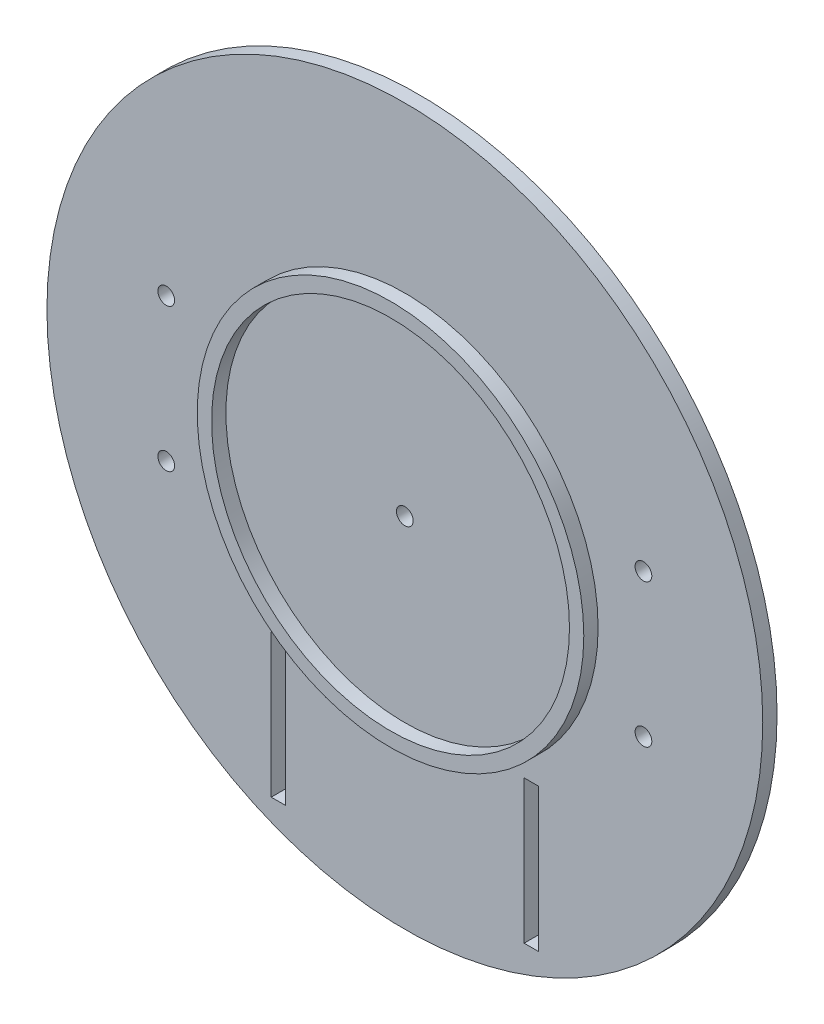
ISO-10303-21;
HEADER;
FILE_DESCRIPTION(('STEP AP214'),'2;1');
FILE_NAME('part.step','',(''),(''),'','','');
FILE_SCHEMA(('AUTOMOTIVE_DESIGN { 1 0 10303 214 1 1 1 1 }'));
ENDSEC;
DATA;
#1=APPLICATION_CONTEXT('core data for automotive mechanical design processes');
#2=APPLICATION_PROTOCOL_DEFINITION('international standard','automotive_design',2000,#1);
#3=PRODUCT_CONTEXT('',#1,'mechanical');
#4=PRODUCT('Part','Part','',(#3));
#5=PRODUCT_RELATED_PRODUCT_CATEGORY('part','',(#4));
#6=PRODUCT_DEFINITION_FORMATION('','',#4);
#7=PRODUCT_DEFINITION_CONTEXT('part definition',#1,'design');
#8=PRODUCT_DEFINITION('design','',#6,#7);
#9=PRODUCT_DEFINITION_SHAPE('','',#8);
#10=(LENGTH_UNIT() NAMED_UNIT(*) SI_UNIT(.MILLI.,.METRE.));
#11=(NAMED_UNIT(*) PLANE_ANGLE_UNIT() SI_UNIT($,.RADIAN.));
#12=(NAMED_UNIT(*) SI_UNIT($,.STERADIAN.) SOLID_ANGLE_UNIT());
#13=UNCERTAINTY_MEASURE_WITH_UNIT(LENGTH_MEASURE(1.E-05),#10,'distance_accuracy_value','');
#14=(GEOMETRIC_REPRESENTATION_CONTEXT(3) GLOBAL_UNCERTAINTY_ASSIGNED_CONTEXT((#13)) GLOBAL_UNIT_ASSIGNED_CONTEXT((#10,
#11,#12)) REPRESENTATION_CONTEXT('',''));
#15=CARTESIAN_POINT('',(0.,0.,0.));
#16=DIRECTION('',(0.,0.,1.));
#17=DIRECTION('',(1.,0.,0.));
#18=AXIS2_PLACEMENT_3D('',#15,#16,#17);
#19=CARTESIAN_POINT('',(0.,0.,3.));
#20=DIRECTION('',(0.,0.,1.));
#21=DIRECTION('',(1.,0.,0.));
#22=AXIS2_PLACEMENT_3D('',#19,#20,#21);
#23=PLANE('',#22);
#24=DIRECTION('',(-1.,0.,0.));
#25=VECTOR('',#24,1.);
#26=CARTESIAN_POINT('',(0.,-35.,3.));
#27=LINE('',#26,#25);
#28=CARTESIAN_POINT('',(28.,-35.,3.));
#29=VERTEX_POINT('',#28);
#30=CARTESIAN_POINT('',(25.,-35.,3.));
#31=VERTEX_POINT('',#30);
#32=EDGE_CURVE('E168',#29,#31,#27,.T.);
#33=ORIENTED_EDGE('',*,*,#32,.F.);
#34=DIRECTION('',(0.,1.,0.));
#35=VECTOR('',#34,1.);
#36=CARTESIAN_POINT('',(28.,0.,3.));
#37=LINE('',#36,#35);
#38=CARTESIAN_POINT('',(28.,-65.,3.));
#39=VERTEX_POINT('',#38);
#40=EDGE_CURVE('E162',#39,#29,#37,.T.);
#41=ORIENTED_EDGE('',*,*,#40,.F.);
#42=DIRECTION('',(-1.,0.,0.));
#43=VECTOR('',#42,1.);
#44=CARTESIAN_POINT('',(0.,-65.,3.));
#45=LINE('',#44,#43);
#46=CARTESIAN_POINT('',(25.,-65.,3.));
#47=VERTEX_POINT('',#46);
#48=EDGE_CURVE('E106',#39,#47,#45,.T.);
#49=ORIENTED_EDGE('',*,*,#48,.T.);
#50=DIRECTION('',(0.,1.,0.));
#51=VECTOR('',#50,1.);
#52=CARTESIAN_POINT('',(25.,0.,3.));
#53=LINE('',#52,#51);
#54=EDGE_CURVE('E165',#47,#31,#53,.T.);
#55=ORIENTED_EDGE('',*,*,#54,.T.);
#56=EDGE_LOOP('',(#33,#41,#49,#55));
#57=FACE_BOUND('',#56,.T.);
#58=CARTESIAN_POINT('',(0.,0.,3.));
#59=DIRECTION('',(0.,0.,1.));
#60=DIRECTION('',(1.,0.,0.));
#61=AXIS2_PLACEMENT_3D('',#58,#59,#60);
#62=CIRCLE('',#61,40.5);
#63=CARTESIAN_POINT('',(40.5,0.,3.));
#64=VERTEX_POINT('',#63);
#65=EDGE_CURVE('E173',#64,#64,#62,.T.);
#66=ORIENTED_EDGE('',*,*,#65,.F.);
#67=EDGE_LOOP('',(#66));
#68=FACE_BOUND('',#67,.T.);
#69=CARTESIAN_POINT('',(50.,15.,3.));
#70=DIRECTION('',(0.,0.,1.));
#71=DIRECTION('',(1.,0.,0.));
#72=AXIS2_PLACEMENT_3D('',#69,#70,#71);
#73=CIRCLE('',#72,1.75);
#74=CARTESIAN_POINT('',(51.75,15.,3.));
#75=VERTEX_POINT('',#74);
#76=EDGE_CURVE('E193',#75,#75,#73,.T.);
#77=ORIENTED_EDGE('',*,*,#76,.F.);
#78=EDGE_LOOP('',(#77));
#79=FACE_BOUND('',#78,.T.);
#80=CARTESIAN_POINT('',(50.,-15.,3.));
#81=DIRECTION('',(0.,0.,1.));
#82=DIRECTION('',(1.,0.,0.));
#83=AXIS2_PLACEMENT_3D('',#80,#81,#82);
#84=CIRCLE('',#83,1.75);
#85=CARTESIAN_POINT('',(51.75,-15.,3.));
#86=VERTEX_POINT('',#85);
#87=EDGE_CURVE('E187',#86,#86,#84,.T.);
#88=ORIENTED_EDGE('',*,*,#87,.F.);
#89=EDGE_LOOP('',(#88));
#90=FACE_BOUND('',#89,.T.);
#91=CARTESIAN_POINT('',(-50.,-15.,3.));
#92=DIRECTION('',(0.,0.,1.));
#93=DIRECTION('',(1.,0.,0.));
#94=AXIS2_PLACEMENT_3D('',#91,#92,#93);
#95=CIRCLE('',#94,1.75);
#96=CARTESIAN_POINT('',(-48.25,-15.,3.));
#97=VERTEX_POINT('',#96);
#98=EDGE_CURVE('E180',#97,#97,#95,.T.);
#99=ORIENTED_EDGE('',*,*,#98,.F.);
#100=EDGE_LOOP('',(#99));
#101=FACE_BOUND('',#100,.T.);
#102=CARTESIAN_POINT('',(-50.,15.,3.));
#103=DIRECTION('',(0.,0.,1.));
#104=DIRECTION('',(1.,0.,0.));
#105=AXIS2_PLACEMENT_3D('',#102,#103,#104);
#106=CIRCLE('',#105,1.75);
#107=CARTESIAN_POINT('',(-48.25,15.,3.));
#108=VERTEX_POINT('',#107);
#109=EDGE_CURVE('E183',#108,#108,#106,.T.);
#110=ORIENTED_EDGE('',*,*,#109,.F.);
#111=EDGE_LOOP('',(#110));
#112=FACE_BOUND('',#111,.T.);
#113=CARTESIAN_POINT('',(0.,0.,3.));
#114=DIRECTION('',(0.,0.,1.));
#115=DIRECTION('',(1.,0.,0.));
#116=AXIS2_PLACEMENT_3D('',#113,#114,#115);
#117=CIRCLE('',#116,75.);
#118=CARTESIAN_POINT('',(75.,0.,3.));
#119=VERTEX_POINT('',#118);
#120=EDGE_CURVE('E44',#119,#119,#117,.T.);
#121=ORIENTED_EDGE('',*,*,#120,.T.);
#122=EDGE_LOOP('',(#121));
#123=FACE_BOUND('',#122,.T.);
#124=DIRECTION('',(1.,0.,0.));
#125=VECTOR('',#124,1.);
#126=CARTESIAN_POINT('',(0.,-65.,3.));
#127=LINE('',#126,#125);
#128=CARTESIAN_POINT('',(-28.,-65.,3.));
#129=VERTEX_POINT('',#128);
#130=CARTESIAN_POINT('',(-25.,-65.,3.));
#131=VERTEX_POINT('',#130);
#132=EDGE_CURVE('E157',#129,#131,#127,.T.);
#133=ORIENTED_EDGE('',*,*,#132,.F.);
#134=DIRECTION('',(0.,1.,0.));
#135=VECTOR('',#134,1.);
#136=CARTESIAN_POINT('',(-28.,0.,3.));
#137=LINE('',#136,#135);
#138=CARTESIAN_POINT('',(-28.,-35.,3.));
#139=VERTEX_POINT('',#138);
#140=EDGE_CURVE('E159',#129,#139,#137,.T.);
#141=ORIENTED_EDGE('',*,*,#140,.T.);
#142=DIRECTION('',(1.,0.,0.));
#143=VECTOR('',#142,1.);
#144=CARTESIAN_POINT('',(0.,-35.,3.));
#145=LINE('',#144,#143);
#146=CARTESIAN_POINT('',(-25.,-35.,3.));
#147=VERTEX_POINT('',#146);
#148=EDGE_CURVE('E130',#139,#147,#145,.T.);
#149=ORIENTED_EDGE('',*,*,#148,.T.);
#150=DIRECTION('',(0.,1.,0.));
#151=VECTOR('',#150,1.);
#152=CARTESIAN_POINT('',(-25.,0.,3.));
#153=LINE('',#152,#151);
#154=EDGE_CURVE('E155',#131,#147,#153,.T.);
#155=ORIENTED_EDGE('',*,*,#154,.F.);
#156=EDGE_LOOP('',(#133,#141,#149,#155));
#157=FACE_BOUND('',#156,.T.);
#158=ADVANCED_FACE('F36',(#57,#68,#79,#90,#101,#112,#123,#157),#23,.T.);
#159=CARTESIAN_POINT('',(0.,0.,0.));
#160=DIRECTION('',(0.,0.,1.));
#161=DIRECTION('',(1.,0.,0.));
#162=AXIS2_PLACEMENT_3D('',#159,#160,#161);
#163=PLANE('',#162);
#164=DIRECTION('',(0.,-1.,0.));
#165=VECTOR('',#164,1.);
#166=CARTESIAN_POINT('',(28.,0.,0.));
#167=LINE('',#166,#165);
#168=CARTESIAN_POINT('',(28.,-35.,0.));
#169=VERTEX_POINT('',#168);
#170=CARTESIAN_POINT('',(28.,-65.,0.));
#171=VERTEX_POINT('',#170);
#172=EDGE_CURVE('E113',#169,#171,#167,.T.);
#173=ORIENTED_EDGE('',*,*,#172,.F.);
#174=DIRECTION('',(1.,0.,0.));
#175=VECTOR('',#174,1.);
#176=CARTESIAN_POINT('',(0.,-35.,0.));
#177=LINE('',#176,#175);
#178=CARTESIAN_POINT('',(25.,-35.,0.));
#179=VERTEX_POINT('',#178);
#180=EDGE_CURVE('E118',#179,#169,#177,.T.);
#181=ORIENTED_EDGE('',*,*,#180,.F.);
#182=DIRECTION('',(0.,-1.,0.));
#183=VECTOR('',#182,1.);
#184=CARTESIAN_POINT('',(25.,0.,0.));
#185=LINE('',#184,#183);
#186=CARTESIAN_POINT('',(25.,-65.,0.));
#187=VERTEX_POINT('',#186);
#188=EDGE_CURVE('E123',#179,#187,#185,.T.);
#189=ORIENTED_EDGE('',*,*,#188,.T.);
#190=DIRECTION('',(1.,0.,0.));
#191=VECTOR('',#190,1.);
#192=CARTESIAN_POINT('',(0.,-65.,0.));
#193=LINE('',#192,#191);
#194=EDGE_CURVE('E103',#187,#171,#193,.T.);
#195=ORIENTED_EDGE('',*,*,#194,.T.);
#196=EDGE_LOOP('',(#173,#181,#189,#195));
#197=FACE_BOUND('',#196,.T.);
#198=CARTESIAN_POINT('',(0.,0.,0.));
#199=DIRECTION('',(0.,0.,1.));
#200=DIRECTION('',(1.,0.,0.));
#201=AXIS2_PLACEMENT_3D('',#198,#199,#200);
#202=CIRCLE('',#201,75.);
#203=CARTESIAN_POINT('',(75.,0.,0.));
#204=VERTEX_POINT('',#203);
#205=EDGE_CURVE('E207',#204,#204,#202,.T.);
#206=ORIENTED_EDGE('',*,*,#205,.F.);
#207=EDGE_LOOP('',(#206));
#208=FACE_BOUND('',#207,.T.);
#209=CARTESIAN_POINT('',(-50.,15.,0.));
#210=DIRECTION('',(0.,0.,1.));
#211=DIRECTION('',(1.,0.,0.));
#212=AXIS2_PLACEMENT_3D('',#209,#210,#211);
#213=CIRCLE('',#212,1.75);
#214=CARTESIAN_POINT('',(-48.25,15.,0.));
#215=VERTEX_POINT('',#214);
#216=EDGE_CURVE('E204',#215,#215,#213,.T.);
#217=ORIENTED_EDGE('',*,*,#216,.T.);
#218=EDGE_LOOP('',(#217));
#219=FACE_BOUND('',#218,.T.);
#220=CARTESIAN_POINT('',(-50.,-15.,0.));
#221=DIRECTION('',(0.,0.,1.));
#222=DIRECTION('',(1.,0.,0.));
#223=AXIS2_PLACEMENT_3D('',#220,#221,#222);
#224=CIRCLE('',#223,1.75);
#225=CARTESIAN_POINT('',(-48.25,-15.,0.));
#226=VERTEX_POINT('',#225);
#227=EDGE_CURVE('E184',#226,#226,#224,.T.);
#228=ORIENTED_EDGE('',*,*,#227,.T.);
#229=EDGE_LOOP('',(#228));
#230=FACE_BOUND('',#229,.T.);
#231=CARTESIAN_POINT('',(50.,-15.,0.));
#232=DIRECTION('',(0.,0.,1.));
#233=DIRECTION('',(1.,0.,0.));
#234=AXIS2_PLACEMENT_3D('',#231,#232,#233);
#235=CIRCLE('',#234,1.75);
#236=CARTESIAN_POINT('',(51.75,-15.,0.));
#237=VERTEX_POINT('',#236);
#238=EDGE_CURVE('E190',#237,#237,#235,.T.);
#239=ORIENTED_EDGE('',*,*,#238,.T.);
#240=EDGE_LOOP('',(#239));
#241=FACE_BOUND('',#240,.T.);
#242=CARTESIAN_POINT('',(50.,15.,0.));
#243=DIRECTION('',(0.,0.,1.));
#244=DIRECTION('',(1.,0.,0.));
#245=AXIS2_PLACEMENT_3D('',#242,#243,#244);
#246=CIRCLE('',#245,1.75);
#247=CARTESIAN_POINT('',(51.75,15.,0.));
#248=VERTEX_POINT('',#247);
#249=EDGE_CURVE('E196',#248,#248,#246,.T.);
#250=ORIENTED_EDGE('',*,*,#249,.T.);
#251=EDGE_LOOP('',(#250));
#252=FACE_BOUND('',#251,.T.);
#253=CARTESIAN_POINT('',(0.,0.,0.));
#254=DIRECTION('',(0.,0.,1.));
#255=DIRECTION('',(1.,0.,0.));
#256=AXIS2_PLACEMENT_3D('',#253,#254,#255);
#257=CIRCLE('',#256,1.75);
#258=CARTESIAN_POINT('',(1.74999999999999,0.,0.));
#259=VERTEX_POINT('',#258);
#260=EDGE_CURVE('E177',#259,#259,#257,.T.);
#261=ORIENTED_EDGE('',*,*,#260,.T.);
#262=EDGE_LOOP('',(#261));
#263=FACE_BOUND('',#262,.T.);
#264=DIRECTION('',(0.,-1.,0.));
#265=VECTOR('',#264,1.);
#266=CARTESIAN_POINT('',(-28.,0.,0.));
#267=LINE('',#266,#265);
#268=CARTESIAN_POINT('',(-28.,-35.,0.));
#269=VERTEX_POINT('',#268);
#270=CARTESIAN_POINT('',(-28.,-65.,0.));
#271=VERTEX_POINT('',#270);
#272=EDGE_CURVE('E133',#269,#271,#267,.T.);
#273=ORIENTED_EDGE('',*,*,#272,.T.);
#274=DIRECTION('',(-1.,0.,0.));
#275=VECTOR('',#274,1.);
#276=CARTESIAN_POINT('',(0.,-65.,0.));
#277=LINE('',#276,#275);
#278=CARTESIAN_POINT('',(-25.,-65.,0.));
#279=VERTEX_POINT('',#278);
#280=EDGE_CURVE('E142',#279,#271,#277,.T.);
#281=ORIENTED_EDGE('',*,*,#280,.F.);
#282=DIRECTION('',(0.,-1.,0.));
#283=VECTOR('',#282,1.);
#284=CARTESIAN_POINT('',(-25.,0.,0.));
#285=LINE('',#284,#283);
#286=CARTESIAN_POINT('',(-25.,-35.,0.));
#287=VERTEX_POINT('',#286);
#288=EDGE_CURVE('E139',#287,#279,#285,.T.);
#289=ORIENTED_EDGE('',*,*,#288,.F.);
#290=DIRECTION('',(-1.,0.,0.));
#291=VECTOR('',#290,1.);
#292=CARTESIAN_POINT('',(0.,-35.,0.));
#293=LINE('',#292,#291);
#294=EDGE_CURVE('E136',#287,#269,#293,.T.);
#295=ORIENTED_EDGE('',*,*,#294,.T.);
#296=EDGE_LOOP('',(#273,#281,#289,#295));
#297=FACE_BOUND('',#296,.T.);
#298=ADVANCED_FACE('F120',(#197,#208,#219,#230,#241,#252,#263,#297),#163,.F.);
#299=CARTESIAN_POINT('',(0.,0.,3.));
#300=DIRECTION('',(0.,0.,1.));
#301=DIRECTION('',(1.,0.,0.));
#302=AXIS2_PLACEMENT_3D('',#299,#300,#301);
#303=CIRCLE('',#302,1.75);
#304=CARTESIAN_POINT('',(1.74999999999999,0.,3.));
#305=VERTEX_POINT('',#304);
#306=EDGE_CURVE('E199',#305,#305,#303,.T.);
#307=ORIENTED_EDGE('',*,*,#306,.F.);
#308=EDGE_LOOP('',(#307));
#309=FACE_BOUND('',#308,.T.);
#310=CARTESIAN_POINT('',(0.,0.,3.));
#311=DIRECTION('',(0.,0.,1.));
#312=DIRECTION('',(1.,0.,0.));
#313=AXIS2_PLACEMENT_3D('',#310,#311,#312);
#314=CIRCLE('',#313,37.5);
#315=CARTESIAN_POINT('',(37.5,0.,3.));
#316=VERTEX_POINT('',#315);
#317=EDGE_CURVE('E11',#316,#316,#314,.F.);
#318=ORIENTED_EDGE('',*,*,#317,.F.);
#319=EDGE_LOOP('',(#318));
#320=FACE_BOUND('',#319,.T.);
#321=ADVANCED_FACE('F216',(#309,#320),#23,.T.);
#322=CARTESIAN_POINT('',(0.,0.,3.));
#323=DIRECTION('',(0.,0.,-1.));
#324=DIRECTION('',(-1.,0.,0.));
#325=AXIS2_PLACEMENT_3D('',#322,#323,#324);
#326=CYLINDRICAL_SURFACE('',#325,75.);
#327=ORIENTED_EDGE('',*,*,#120,.F.);
#328=EDGE_LOOP('',(#327));
#329=FACE_BOUND('',#328,.T.);
#330=ORIENTED_EDGE('',*,*,#205,.T.);
#331=EDGE_LOOP('',(#330));
#332=FACE_BOUND('',#331,.T.);
#333=ADVANCED_FACE('F38',(#329,#332),#326,.T.);
#334=CARTESIAN_POINT('',(-50.,15.,0.));
#335=DIRECTION('',(0.,0.,1.));
#336=DIRECTION('',(1.,0.,0.));
#337=AXIS2_PLACEMENT_3D('',#334,#335,#336);
#338=CYLINDRICAL_SURFACE('',#337,1.75);
#339=ORIENTED_EDGE('',*,*,#216,.F.);
#340=EDGE_LOOP('',(#339));
#341=FACE_BOUND('',#340,.T.);
#342=ORIENTED_EDGE('',*,*,#109,.T.);
#343=EDGE_LOOP('',(#342));
#344=FACE_BOUND('',#343,.T.);
#345=ADVANCED_FACE('F264',(#341,#344),#338,.F.);
#346=CARTESIAN_POINT('',(-50.,-15.,0.));
#347=DIRECTION('',(0.,0.,1.));
#348=DIRECTION('',(1.,0.,0.));
#349=AXIS2_PLACEMENT_3D('',#346,#347,#348);
#350=CYLINDRICAL_SURFACE('',#349,1.75);
#351=ORIENTED_EDGE('',*,*,#227,.F.);
#352=EDGE_LOOP('',(#351));
#353=FACE_BOUND('',#352,.T.);
#354=ORIENTED_EDGE('',*,*,#98,.T.);
#355=EDGE_LOOP('',(#354));
#356=FACE_BOUND('',#355,.T.);
#357=ADVANCED_FACE('F288',(#353,#356),#350,.F.);
#358=CARTESIAN_POINT('',(50.,-15.,0.));
#359=DIRECTION('',(0.,0.,1.));
#360=DIRECTION('',(1.,0.,0.));
#361=AXIS2_PLACEMENT_3D('',#358,#359,#360);
#362=CYLINDRICAL_SURFACE('',#361,1.75);
#363=ORIENTED_EDGE('',*,*,#238,.F.);
#364=EDGE_LOOP('',(#363));
#365=FACE_BOUND('',#364,.T.);
#366=ORIENTED_EDGE('',*,*,#87,.T.);
#367=EDGE_LOOP('',(#366));
#368=FACE_BOUND('',#367,.T.);
#369=ADVANCED_FACE('F291',(#365,#368),#362,.F.);
#370=CARTESIAN_POINT('',(50.,15.,0.));
#371=DIRECTION('',(0.,0.,1.));
#372=DIRECTION('',(1.,0.,0.));
#373=AXIS2_PLACEMENT_3D('',#370,#371,#372);
#374=CYLINDRICAL_SURFACE('',#373,1.75);
#375=ORIENTED_EDGE('',*,*,#249,.F.);
#376=EDGE_LOOP('',(#375));
#377=FACE_BOUND('',#376,.T.);
#378=ORIENTED_EDGE('',*,*,#76,.T.);
#379=EDGE_LOOP('',(#378));
#380=FACE_BOUND('',#379,.T.);
#381=ADVANCED_FACE('F295',(#377,#380),#374,.F.);
#382=CARTESIAN_POINT('',(0.,0.,0.));
#383=DIRECTION('',(0.,0.,1.));
#384=DIRECTION('',(1.,0.,0.));
#385=AXIS2_PLACEMENT_3D('',#382,#383,#384);
#386=CYLINDRICAL_SURFACE('',#385,1.75);
#387=ORIENTED_EDGE('',*,*,#260,.F.);
#388=EDGE_LOOP('',(#387));
#389=FACE_BOUND('',#388,.T.);
#390=ORIENTED_EDGE('',*,*,#306,.T.);
#391=EDGE_LOOP('',(#390));
#392=FACE_BOUND('',#391,.T.);
#393=ADVANCED_FACE('F285',(#389,#392),#386,.F.);
#394=CARTESIAN_POINT('',(0.,0.,6.));
#395=DIRECTION('',(0.,0.,1.));
#396=DIRECTION('',(1.,0.,0.));
#397=AXIS2_PLACEMENT_3D('',#394,#395,#396);
#398=PLANE('',#397);
#399=CARTESIAN_POINT('',(0.,0.,6.));
#400=DIRECTION('',(0.,0.,1.));
#401=DIRECTION('',(1.,0.,0.));
#402=AXIS2_PLACEMENT_3D('',#399,#400,#401);
#403=CIRCLE('',#402,40.5);
#404=CARTESIAN_POINT('',(40.5,0.,6.));
#405=VERTEX_POINT('',#404);
#406=EDGE_CURVE('E174',#405,#405,#403,.T.);
#407=ORIENTED_EDGE('',*,*,#406,.T.);
#408=EDGE_LOOP('',(#407));
#409=FACE_BOUND('',#408,.T.);
#410=CARTESIAN_POINT('',(0.,0.,6.));
#411=DIRECTION('',(0.,0.,1.));
#412=DIRECTION('',(1.,0.,0.));
#413=AXIS2_PLACEMENT_3D('',#410,#411,#412);
#414=CIRCLE('',#413,37.5);
#415=CARTESIAN_POINT('',(37.5,0.,6.));
#416=VERTEX_POINT('',#415);
#417=EDGE_CURVE('E170',#416,#416,#414,.T.);
#418=ORIENTED_EDGE('',*,*,#417,.F.);
#419=EDGE_LOOP('',(#418));
#420=FACE_BOUND('',#419,.T.);
#421=ADVANCED_FACE('F280',(#409,#420),#398,.T.);
#422=CARTESIAN_POINT('',(0.,0.,6.));
#423=DIRECTION('',(0.,0.,-1.));
#424=DIRECTION('',(-1.,0.,0.));
#425=AXIS2_PLACEMENT_3D('',#422,#423,#424);
#426=CYLINDRICAL_SURFACE('',#425,40.5);
#427=ORIENTED_EDGE('',*,*,#406,.F.);
#428=EDGE_LOOP('',(#427));
#429=FACE_BOUND('',#428,.T.);
#430=ORIENTED_EDGE('',*,*,#65,.T.);
#431=EDGE_LOOP('',(#430));
#432=FACE_BOUND('',#431,.T.);
#433=ADVANCED_FACE('F272',(#429,#432),#426,.T.);
#434=CARTESIAN_POINT('',(0.,0.,6.));
#435=DIRECTION('',(0.,0.,-1.));
#436=DIRECTION('',(-1.,0.,0.));
#437=AXIS2_PLACEMENT_3D('',#434,#435,#436);
#438=CYLINDRICAL_SURFACE('',#437,37.5);
#439=ORIENTED_EDGE('',*,*,#417,.T.);
#440=EDGE_LOOP('',(#439));
#441=FACE_BOUND('',#440,.T.);
#442=ORIENTED_EDGE('',*,*,#317,.T.);
#443=EDGE_LOOP('',(#442));
#444=FACE_BOUND('',#443,.T.);
#445=ADVANCED_FACE('F270',(#441,#444),#438,.F.);
#446=CARTESIAN_POINT('',(-28.,0.,6.));
#447=DIRECTION('',(1.,0.,0.));
#448=DIRECTION('',(0.,1.,0.));
#449=AXIS2_PLACEMENT_3D('',#446,#447,#448);
#450=PLANE('',#449);
#451=DIRECTION('',(0.,0.,-1.));
#452=VECTOR('',#451,1.);
#453=CARTESIAN_POINT('',(-28.,-65.,6.));
#454=LINE('',#453,#452);
#455=EDGE_CURVE('E146',#129,#271,#454,.T.);
#456=ORIENTED_EDGE('',*,*,#455,.T.);
#457=ORIENTED_EDGE('',*,*,#272,.F.);
#458=DIRECTION('',(0.,0.,-1.));
#459=VECTOR('',#458,1.);
#460=CARTESIAN_POINT('',(-28.,-35.,6.));
#461=LINE('',#460,#459);
#462=EDGE_CURVE('E145',#139,#269,#461,.T.);
#463=ORIENTED_EDGE('',*,*,#462,.F.);
#464=ORIENTED_EDGE('',*,*,#140,.F.);
#465=EDGE_LOOP('',(#456,#457,#463,#464));
#466=FACE_BOUND('',#465,.T.);
#467=ADVANCED_FACE('F231',(#466),#450,.T.);
#468=CARTESIAN_POINT('',(0.,-65.,6.));
#469=DIRECTION('',(0.,-1.,0.));
#470=DIRECTION('',(0.,0.,-1.));
#471=AXIS2_PLACEMENT_3D('',#468,#469,#470);
#472=PLANE('',#471);
#473=ORIENTED_EDGE('',*,*,#132,.T.);
#474=DIRECTION('',(0.,0.,-1.));
#475=VECTOR('',#474,1.);
#476=CARTESIAN_POINT('',(-25.,-65.,6.));
#477=LINE('',#476,#475);
#478=EDGE_CURVE('E148',#131,#279,#477,.T.);
#479=ORIENTED_EDGE('',*,*,#478,.T.);
#480=ORIENTED_EDGE('',*,*,#280,.T.);
#481=ORIENTED_EDGE('',*,*,#455,.F.);
#482=EDGE_LOOP('',(#473,#479,#480,#481));
#483=FACE_BOUND('',#482,.T.);
#484=ADVANCED_FACE('F238',(#483),#472,.F.);
#485=CARTESIAN_POINT('',(-25.,0.,6.));
#486=DIRECTION('',(1.,0.,0.));
#487=DIRECTION('',(0.,1.,0.));
#488=AXIS2_PLACEMENT_3D('',#485,#486,#487);
#489=PLANE('',#488);
#490=ORIENTED_EDGE('',*,*,#154,.T.);
#491=DIRECTION('',(0.,0.,-1.));
#492=VECTOR('',#491,1.);
#493=CARTESIAN_POINT('',(-25.,-35.,6.));
#494=LINE('',#493,#492);
#495=EDGE_CURVE('E59',#147,#287,#494,.T.);
#496=ORIENTED_EDGE('',*,*,#495,.T.);
#497=ORIENTED_EDGE('',*,*,#288,.T.);
#498=ORIENTED_EDGE('',*,*,#478,.F.);
#499=EDGE_LOOP('',(#490,#496,#497,#498));
#500=FACE_BOUND('',#499,.T.);
#501=ADVANCED_FACE('F241',(#500),#489,.F.);
#502=CARTESIAN_POINT('',(0.,-35.,6.));
#503=DIRECTION('',(0.,-1.,0.));
#504=DIRECTION('',(0.,0.,-1.));
#505=AXIS2_PLACEMENT_3D('',#502,#503,#504);
#506=PLANE('',#505);
#507=ORIENTED_EDGE('',*,*,#462,.T.);
#508=ORIENTED_EDGE('',*,*,#294,.F.);
#509=ORIENTED_EDGE('',*,*,#495,.F.);
#510=ORIENTED_EDGE('',*,*,#148,.F.);
#511=EDGE_LOOP('',(#507,#508,#509,#510));
#512=FACE_BOUND('',#511,.T.);
#513=ADVANCED_FACE('F233',(#512),#506,.T.);
#514=CARTESIAN_POINT('',(0.,-35.,6.));
#515=DIRECTION('',(0.,1.,0.));
#516=DIRECTION('',(0.,0.,1.));
#517=AXIS2_PLACEMENT_3D('',#514,#515,#516);
#518=PLANE('',#517);
#519=ORIENTED_EDGE('',*,*,#32,.T.);
#520=DIRECTION('',(0.,0.,-1.));
#521=VECTOR('',#520,1.);
#522=CARTESIAN_POINT('',(25.,-35.,6.));
#523=LINE('',#522,#521);
#524=EDGE_CURVE('E128',#31,#179,#523,.T.);
#525=ORIENTED_EDGE('',*,*,#524,.T.);
#526=ORIENTED_EDGE('',*,*,#180,.T.);
#527=DIRECTION('',(0.,0.,-1.));
#528=VECTOR('',#527,1.);
#529=CARTESIAN_POINT('',(28.,-35.,6.));
#530=LINE('',#529,#528);
#531=EDGE_CURVE('E109',#29,#169,#530,.T.);
#532=ORIENTED_EDGE('',*,*,#531,.F.);
#533=EDGE_LOOP('',(#519,#525,#526,#532));
#534=FACE_BOUND('',#533,.T.);
#535=ADVANCED_FACE('F248',(#534),#518,.F.);
#536=CARTESIAN_POINT('',(25.,0.,6.));
#537=DIRECTION('',(1.,0.,0.));
#538=DIRECTION('',(0.,1.,0.));
#539=AXIS2_PLACEMENT_3D('',#536,#537,#538);
#540=PLANE('',#539);
#541=DIRECTION('',(0.,0.,-1.));
#542=VECTOR('',#541,1.);
#543=CARTESIAN_POINT('',(25.,-65.,6.));
#544=LINE('',#543,#542);
#545=EDGE_CURVE('E108',#47,#187,#544,.T.);
#546=ORIENTED_EDGE('',*,*,#545,.T.);
#547=ORIENTED_EDGE('',*,*,#188,.F.);
#548=ORIENTED_EDGE('',*,*,#524,.F.);
#549=ORIENTED_EDGE('',*,*,#54,.F.);
#550=EDGE_LOOP('',(#546,#547,#548,#549));
#551=FACE_BOUND('',#550,.T.);
#552=ADVANCED_FACE('F388',(#551),#540,.T.);
#553=CARTESIAN_POINT('',(0.,-65.,6.));
#554=DIRECTION('',(0.,1.,0.));
#555=DIRECTION('',(0.,0.,1.));
#556=AXIS2_PLACEMENT_3D('',#553,#554,#555);
#557=PLANE('',#556);
#558=DIRECTION('',(0.,0.,-1.));
#559=VECTOR('',#558,1.);
#560=CARTESIAN_POINT('',(28.,-65.,6.));
#561=LINE('',#560,#559);
#562=EDGE_CURVE('E51',#39,#171,#561,.T.);
#563=ORIENTED_EDGE('',*,*,#562,.T.);
#564=ORIENTED_EDGE('',*,*,#194,.F.);
#565=ORIENTED_EDGE('',*,*,#545,.F.);
#566=ORIENTED_EDGE('',*,*,#48,.F.);
#567=EDGE_LOOP('',(#563,#564,#565,#566));
#568=FACE_BOUND('',#567,.T.);
#569=ADVANCED_FACE('F100',(#568),#557,.T.);
#570=CARTESIAN_POINT('',(28.,0.,6.));
#571=DIRECTION('',(1.,0.,0.));
#572=DIRECTION('',(0.,1.,0.));
#573=AXIS2_PLACEMENT_3D('',#570,#571,#572);
#574=PLANE('',#573);
#575=ORIENTED_EDGE('',*,*,#40,.T.);
#576=ORIENTED_EDGE('',*,*,#531,.T.);
#577=ORIENTED_EDGE('',*,*,#172,.T.);
#578=ORIENTED_EDGE('',*,*,#562,.F.);
#579=EDGE_LOOP('',(#575,#576,#577,#578));
#580=FACE_BOUND('',#579,.T.);
#581=ADVANCED_FACE('F114',(#580),#574,.F.);
#582=CLOSED_SHELL('',(#158,#298,#321,#333,#345,#357,#369,#381,#393,#421,#433,#445,#467,#484,
#501,#513,#535,#552,#569,#581));
#583=MANIFOLD_SOLID_BREP('B2',#582);
#584=ADVANCED_BREP_SHAPE_REPRESENTATION('',(#18,#583),#14);
#585=SHAPE_DEFINITION_REPRESENTATION(#9,#584);
ENDSEC;
END-ISO-10303-21;
